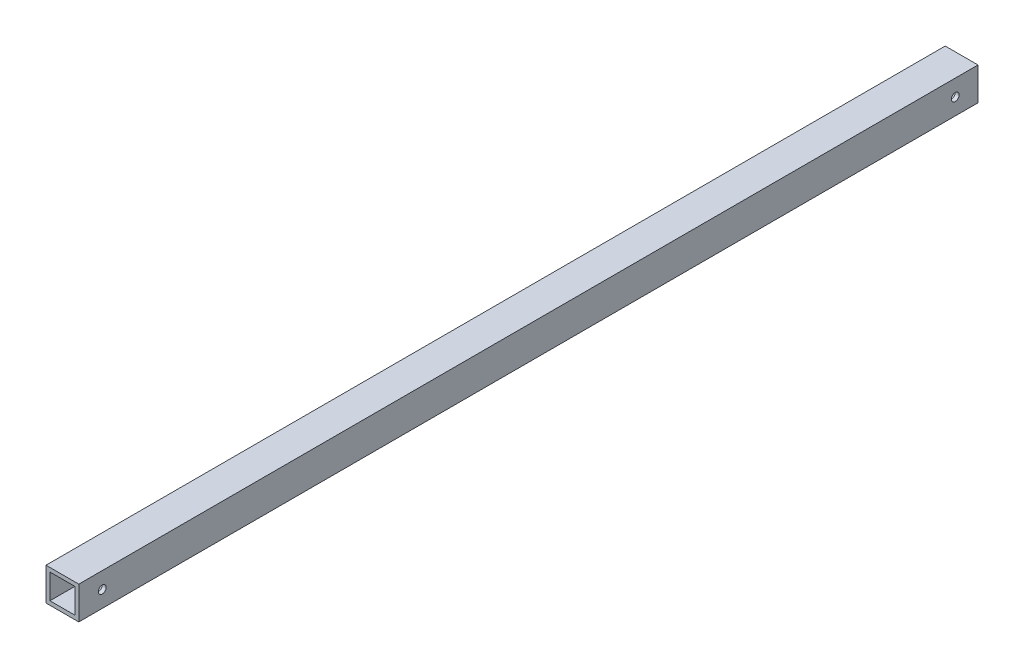
ISO-10303-21;
HEADER;
FILE_DESCRIPTION(('STEP AP214'),'2;1');
FILE_NAME('part.step','',(''),(''),'','','');
FILE_SCHEMA(('AUTOMOTIVE_DESIGN { 1 0 10303 214 1 1 1 1 }'));
ENDSEC;
DATA;
#1=APPLICATION_CONTEXT('core data for automotive mechanical design processes');
#2=APPLICATION_PROTOCOL_DEFINITION('international standard','automotive_design',2000,#1);
#3=PRODUCT_CONTEXT('',#1,'mechanical');
#4=PRODUCT('Part','Part','',(#3));
#5=PRODUCT_RELATED_PRODUCT_CATEGORY('part','',(#4));
#6=PRODUCT_DEFINITION_FORMATION('','',#4);
#7=PRODUCT_DEFINITION_CONTEXT('part definition',#1,'design');
#8=PRODUCT_DEFINITION('design','',#6,#7);
#9=PRODUCT_DEFINITION_SHAPE('','',#8);
#10=(LENGTH_UNIT() NAMED_UNIT(*) SI_UNIT(.MILLI.,.METRE.));
#11=(NAMED_UNIT(*) PLANE_ANGLE_UNIT() SI_UNIT($,.RADIAN.));
#12=(NAMED_UNIT(*) SI_UNIT($,.STERADIAN.) SOLID_ANGLE_UNIT());
#13=UNCERTAINTY_MEASURE_WITH_UNIT(LENGTH_MEASURE(1.E-05),#10,'distance_accuracy_value','');
#14=(GEOMETRIC_REPRESENTATION_CONTEXT(3) GLOBAL_UNCERTAINTY_ASSIGNED_CONTEXT((#13)) GLOBAL_UNIT_ASSIGNED_CONTEXT((#10,
#11,#12)) REPRESENTATION_CONTEXT('',''));
#15=CARTESIAN_POINT('',(0.,0.,0.));
#16=DIRECTION('',(0.,0.,1.));
#17=DIRECTION('',(1.,0.,0.));
#18=AXIS2_PLACEMENT_3D('',#15,#16,#17);
#19=CARTESIAN_POINT('',(0.,-25.,685.5));
#20=DIRECTION('',(0.,0.,1.));
#21=DIRECTION('',(1.,0.,0.));
#22=AXIS2_PLACEMENT_3D('',#19,#20,#21);
#23=PLANE('',#22);
#24=DIRECTION('',(0.,-1.,0.));
#25=VECTOR('',#24,1.);
#26=CARTESIAN_POINT('',(0.,0.,685.5));
#27=LINE('',#26,#25);
#28=CARTESIAN_POINT('',(0.,0.,685.5));
#29=VERTEX_POINT('',#28);
#30=CARTESIAN_POINT('',(0.,-25.,685.5));
#31=VERTEX_POINT('',#30);
#32=EDGE_CURVE('E135',#29,#31,#27,.T.);
#33=ORIENTED_EDGE('',*,*,#32,.T.);
#34=DIRECTION('',(1.,0.,0.));
#35=VECTOR('',#34,1.);
#36=CARTESIAN_POINT('',(0.,-25.,685.5));
#37=LINE('',#36,#35);
#38=CARTESIAN_POINT('',(25.,-25.,685.5));
#39=VERTEX_POINT('',#38);
#40=EDGE_CURVE('E138',#31,#39,#37,.T.);
#41=ORIENTED_EDGE('',*,*,#40,.T.);
#42=DIRECTION('',(0.,1.,0.));
#43=VECTOR('',#42,1.);
#44=CARTESIAN_POINT('',(25.,0.,685.5));
#45=LINE('',#44,#43);
#46=CARTESIAN_POINT('',(25.,0.,685.5));
#47=VERTEX_POINT('',#46);
#48=EDGE_CURVE('E141',#39,#47,#45,.T.);
#49=ORIENTED_EDGE('',*,*,#48,.T.);
#50=DIRECTION('',(-1.,0.,0.));
#51=VECTOR('',#50,1.);
#52=CARTESIAN_POINT('',(0.,0.,685.5));
#53=LINE('',#52,#51);
#54=EDGE_CURVE('E143',#47,#29,#53,.T.);
#55=ORIENTED_EDGE('',*,*,#54,.T.);
#56=EDGE_LOOP('',(#33,#41,#49,#55));
#57=FACE_BOUND('',#56,.T.);
#58=DIRECTION('',(1.,0.,0.));
#59=VECTOR('',#58,1.);
#60=CARTESIAN_POINT('',(3.,-22.,685.5));
#61=LINE('',#60,#59);
#62=CARTESIAN_POINT('',(3.,-22.,685.5));
#63=VERTEX_POINT('',#62);
#64=CARTESIAN_POINT('',(22.,-22.,685.5));
#65=VERTEX_POINT('',#64);
#66=EDGE_CURVE('E106',#63,#65,#61,.T.);
#67=ORIENTED_EDGE('',*,*,#66,.F.);
#68=DIRECTION('',(0.,-1.,0.));
#69=VECTOR('',#68,1.);
#70=CARTESIAN_POINT('',(3.,-3.,685.5));
#71=LINE('',#70,#69);
#72=CARTESIAN_POINT('',(3.,-3.,685.5));
#73=VERTEX_POINT('',#72);
#74=EDGE_CURVE('E98',#73,#63,#71,.T.);
#75=ORIENTED_EDGE('',*,*,#74,.F.);
#76=DIRECTION('',(-1.,0.,0.));
#77=VECTOR('',#76,1.);
#78=CARTESIAN_POINT('',(3.,-3.,685.5));
#79=LINE('',#78,#77);
#80=CARTESIAN_POINT('',(22.,-3.,685.5));
#81=VERTEX_POINT('',#80);
#82=EDGE_CURVE('E120',#81,#73,#79,.T.);
#83=ORIENTED_EDGE('',*,*,#82,.F.);
#84=DIRECTION('',(0.,1.,0.));
#85=VECTOR('',#84,1.);
#86=CARTESIAN_POINT('',(22.,-3.,685.5));
#87=LINE('',#86,#85);
#88=EDGE_CURVE('E118',#65,#81,#87,.T.);
#89=ORIENTED_EDGE('',*,*,#88,.F.);
#90=EDGE_LOOP('',(#67,#75,#83,#89));
#91=FACE_BOUND('',#90,.T.);
#92=ADVANCED_FACE('F32',(#57,#91),#23,.T.);
#93=CARTESIAN_POINT('',(0.,-25.,0.));
#94=DIRECTION('',(0.,0.,1.));
#95=DIRECTION('',(1.,0.,0.));
#96=AXIS2_PLACEMENT_3D('',#93,#94,#95);
#97=PLANE('',#96);
#98=DIRECTION('',(0.,-1.,0.));
#99=VECTOR('',#98,1.);
#100=CARTESIAN_POINT('',(0.,0.,0.));
#101=LINE('',#100,#99);
#102=CARTESIAN_POINT('',(0.,0.,0.));
#103=VERTEX_POINT('',#102);
#104=CARTESIAN_POINT('',(0.,-25.,0.));
#105=VERTEX_POINT('',#104);
#106=EDGE_CURVE('E114',#103,#105,#101,.T.);
#107=ORIENTED_EDGE('',*,*,#106,.F.);
#108=DIRECTION('',(-1.,0.,0.));
#109=VECTOR('',#108,1.);
#110=CARTESIAN_POINT('',(0.,0.,0.));
#111=LINE('',#110,#109);
#112=CARTESIAN_POINT('',(25.,0.,0.));
#113=VERTEX_POINT('',#112);
#114=EDGE_CURVE('E139',#113,#103,#111,.T.);
#115=ORIENTED_EDGE('',*,*,#114,.F.);
#116=DIRECTION('',(0.,1.,0.));
#117=VECTOR('',#116,1.);
#118=CARTESIAN_POINT('',(25.,0.,0.));
#119=LINE('',#118,#117);
#120=CARTESIAN_POINT('',(25.,-25.,0.));
#121=VERTEX_POINT('',#120);
#122=EDGE_CURVE('E150',#121,#113,#119,.T.);
#123=ORIENTED_EDGE('',*,*,#122,.F.);
#124=DIRECTION('',(1.,0.,0.));
#125=VECTOR('',#124,1.);
#126=CARTESIAN_POINT('',(0.,-25.,0.));
#127=LINE('',#126,#125);
#128=EDGE_CURVE('E148',#105,#121,#127,.T.);
#129=ORIENTED_EDGE('',*,*,#128,.F.);
#130=EDGE_LOOP('',(#107,#115,#123,#129));
#131=FACE_BOUND('',#130,.T.);
#132=DIRECTION('',(0.,-1.,0.));
#133=VECTOR('',#132,1.);
#134=CARTESIAN_POINT('',(3.,-3.,0.));
#135=LINE('',#134,#133);
#136=CARTESIAN_POINT('',(3.,-3.,0.));
#137=VERTEX_POINT('',#136);
#138=CARTESIAN_POINT('',(3.,-22.,0.));
#139=VERTEX_POINT('',#138);
#140=EDGE_CURVE('E56',#137,#139,#135,.T.);
#141=ORIENTED_EDGE('',*,*,#140,.T.);
#142=DIRECTION('',(1.,0.,0.));
#143=VECTOR('',#142,1.);
#144=CARTESIAN_POINT('',(3.,-22.,0.));
#145=LINE('',#144,#143);
#146=CARTESIAN_POINT('',(22.,-22.,0.));
#147=VERTEX_POINT('',#146);
#148=EDGE_CURVE('E113',#139,#147,#145,.T.);
#149=ORIENTED_EDGE('',*,*,#148,.T.);
#150=DIRECTION('',(0.,1.,0.));
#151=VECTOR('',#150,1.);
#152=CARTESIAN_POINT('',(22.,-3.,0.));
#153=LINE('',#152,#151);
#154=CARTESIAN_POINT('',(22.,-3.,0.));
#155=VERTEX_POINT('',#154);
#156=EDGE_CURVE('E127',#147,#155,#153,.T.);
#157=ORIENTED_EDGE('',*,*,#156,.T.);
#158=DIRECTION('',(-1.,0.,0.));
#159=VECTOR('',#158,1.);
#160=CARTESIAN_POINT('',(3.,-3.,0.));
#161=LINE('',#160,#159);
#162=EDGE_CURVE('E107',#155,#137,#161,.T.);
#163=ORIENTED_EDGE('',*,*,#162,.T.);
#164=EDGE_LOOP('',(#141,#149,#157,#163));
#165=FACE_BOUND('',#164,.T.);
#166=ADVANCED_FACE('F169',(#131,#165),#97,.F.);
#167=CARTESIAN_POINT('',(0.,0.,685.5));
#168=DIRECTION('',(1.,0.,0.));
#169=DIRECTION('',(0.,1.,0.));
#170=AXIS2_PLACEMENT_3D('',#167,#168,#169);
#171=PLANE('',#170);
#172=CARTESIAN_POINT('',(0.,-12.5,17.35));
#173=DIRECTION('',(-1.,0.,0.));
#174=DIRECTION('',(0.,-1.,0.));
#175=AXIS2_PLACEMENT_3D('',#172,#173,#174);
#176=CIRCLE('',#175,5.99999999999999);
#177=CARTESIAN_POINT('',(0.,-18.5,17.35));
#178=VERTEX_POINT('',#177);
#179=EDGE_CURVE('E259',#178,#178,#176,.T.);
#180=ORIENTED_EDGE('',*,*,#179,.F.);
#181=EDGE_LOOP('',(#180));
#182=FACE_BOUND('',#181,.T.);
#183=CARTESIAN_POINT('',(0.,-12.5,667.65));
#184=DIRECTION('',(-1.,0.,0.));
#185=DIRECTION('',(0.,-1.,0.));
#186=AXIS2_PLACEMENT_3D('',#183,#184,#185);
#187=CIRCLE('',#186,5.99999999999999);
#188=CARTESIAN_POINT('',(0.,-18.5,667.65));
#189=VERTEX_POINT('',#188);
#190=EDGE_CURVE('E214',#189,#189,#187,.T.);
#191=ORIENTED_EDGE('',*,*,#190,.F.);
#192=EDGE_LOOP('',(#191));
#193=FACE_BOUND('',#192,.T.);
#194=ORIENTED_EDGE('',*,*,#106,.T.);
#195=DIRECTION('',(0.,0.,-1.));
#196=VECTOR('',#195,1.);
#197=CARTESIAN_POINT('',(0.,-25.,685.5));
#198=LINE('',#197,#196);
#199=EDGE_CURVE('E11',#31,#105,#198,.T.);
#200=ORIENTED_EDGE('',*,*,#199,.F.);
#201=ORIENTED_EDGE('',*,*,#32,.F.);
#202=DIRECTION('',(0.,0.,-1.));
#203=VECTOR('',#202,1.);
#204=CARTESIAN_POINT('',(0.,0.,685.5));
#205=LINE('',#204,#203);
#206=EDGE_CURVE('E145',#29,#103,#205,.T.);
#207=ORIENTED_EDGE('',*,*,#206,.T.);
#208=EDGE_LOOP('',(#194,#200,#201,#207));
#209=FACE_BOUND('',#208,.T.);
#210=ADVANCED_FACE('F34',(#182,#193,#209),#171,.F.);
#211=CARTESIAN_POINT('',(0.,-25.,685.5));
#212=DIRECTION('',(0.,1.,0.));
#213=DIRECTION('',(0.,0.,1.));
#214=AXIS2_PLACEMENT_3D('',#211,#212,#213);
#215=PLANE('',#214);
#216=ORIENTED_EDGE('',*,*,#128,.T.);
#217=DIRECTION('',(0.,0.,-1.));
#218=VECTOR('',#217,1.);
#219=CARTESIAN_POINT('',(25.,-25.,685.5));
#220=LINE('',#219,#218);
#221=EDGE_CURVE('E41',#39,#121,#220,.T.);
#222=ORIENTED_EDGE('',*,*,#221,.F.);
#223=ORIENTED_EDGE('',*,*,#40,.F.);
#224=ORIENTED_EDGE('',*,*,#199,.T.);
#225=EDGE_LOOP('',(#216,#222,#223,#224));
#226=FACE_BOUND('',#225,.T.);
#227=ADVANCED_FACE('F179',(#226),#215,.F.);
#228=CARTESIAN_POINT('',(25.,0.,685.5));
#229=DIRECTION('',(-1.,0.,0.));
#230=DIRECTION('',(0.,-1.,0.));
#231=AXIS2_PLACEMENT_3D('',#228,#229,#230);
#232=PLANE('',#231);
#233=CARTESIAN_POINT('',(25.,-12.5,17.35));
#234=DIRECTION('',(1.,0.,0.));
#235=DIRECTION('',(0.,0.,-1.));
#236=AXIS2_PLACEMENT_3D('',#233,#234,#235);
#237=CIRCLE('',#236,2.99999999999999);
#238=CARTESIAN_POINT('',(25.,-12.5,14.35));
#239=VERTEX_POINT('',#238);
#240=EDGE_CURVE('E215',#239,#239,#237,.T.);
#241=ORIENTED_EDGE('',*,*,#240,.F.);
#242=EDGE_LOOP('',(#241));
#243=FACE_BOUND('',#242,.T.);
#244=CARTESIAN_POINT('',(25.,-12.5,667.65));
#245=DIRECTION('',(1.,0.,0.));
#246=DIRECTION('',(0.,0.,-1.));
#247=AXIS2_PLACEMENT_3D('',#244,#245,#246);
#248=CIRCLE('',#247,2.99999999999999);
#249=CARTESIAN_POINT('',(25.,-12.5,664.65));
#250=VERTEX_POINT('',#249);
#251=EDGE_CURVE('E218',#250,#250,#248,.T.);
#252=ORIENTED_EDGE('',*,*,#251,.F.);
#253=EDGE_LOOP('',(#252));
#254=FACE_BOUND('',#253,.T.);
#255=ORIENTED_EDGE('',*,*,#122,.T.);
#256=DIRECTION('',(0.,0.,-1.));
#257=VECTOR('',#256,1.);
#258=CARTESIAN_POINT('',(25.,0.,685.5));
#259=LINE('',#258,#257);
#260=EDGE_CURVE('E155',#47,#113,#259,.T.);
#261=ORIENTED_EDGE('',*,*,#260,.F.);
#262=ORIENTED_EDGE('',*,*,#48,.F.);
#263=ORIENTED_EDGE('',*,*,#221,.T.);
#264=EDGE_LOOP('',(#255,#261,#262,#263));
#265=FACE_BOUND('',#264,.T.);
#266=ADVANCED_FACE('F163',(#243,#254,#265),#232,.F.);
#267=CARTESIAN_POINT('',(0.,0.,685.5));
#268=DIRECTION('',(0.,-1.,0.));
#269=DIRECTION('',(0.,0.,-1.));
#270=AXIS2_PLACEMENT_3D('',#267,#268,#269);
#271=PLANE('',#270);
#272=ORIENTED_EDGE('',*,*,#114,.T.);
#273=ORIENTED_EDGE('',*,*,#206,.F.);
#274=ORIENTED_EDGE('',*,*,#54,.F.);
#275=ORIENTED_EDGE('',*,*,#260,.T.);
#276=EDGE_LOOP('',(#272,#273,#274,#275));
#277=FACE_BOUND('',#276,.T.);
#278=ADVANCED_FACE('F173',(#277),#271,.F.);
#279=CARTESIAN_POINT('',(3.,-3.,685.5));
#280=DIRECTION('',(1.,0.,0.));
#281=DIRECTION('',(0.,1.,0.));
#282=AXIS2_PLACEMENT_3D('',#279,#280,#281);
#283=PLANE('',#282);
#284=CARTESIAN_POINT('',(3.,-12.5,17.35));
#285=DIRECTION('',(1.,0.,0.));
#286=DIRECTION('',(0.,1.,0.));
#287=AXIS2_PLACEMENT_3D('',#284,#285,#286);
#288=CIRCLE('',#287,5.99999999999999);
#289=CARTESIAN_POINT('',(3.,-6.50000000000001,17.35));
#290=VERTEX_POINT('',#289);
#291=EDGE_CURVE('E209',#290,#290,#288,.F.);
#292=ORIENTED_EDGE('',*,*,#291,.T.);
#293=EDGE_LOOP('',(#292));
#294=FACE_BOUND('',#293,.T.);
#295=CARTESIAN_POINT('',(3.,-12.5,667.65));
#296=DIRECTION('',(1.,0.,0.));
#297=DIRECTION('',(0.,1.,0.));
#298=AXIS2_PLACEMENT_3D('',#295,#296,#297);
#299=CIRCLE('',#298,5.99999999999999);
#300=CARTESIAN_POINT('',(3.,-6.50000000000001,667.65));
#301=VERTEX_POINT('',#300);
#302=EDGE_CURVE('E212',#301,#301,#299,.F.);
#303=ORIENTED_EDGE('',*,*,#302,.T.);
#304=EDGE_LOOP('',(#303));
#305=FACE_BOUND('',#304,.T.);
#306=ORIENTED_EDGE('',*,*,#140,.F.);
#307=DIRECTION('',(0.,0.,-1.));
#308=VECTOR('',#307,1.);
#309=CARTESIAN_POINT('',(3.,-3.,685.5));
#310=LINE('',#309,#308);
#311=EDGE_CURVE('E102',#73,#137,#310,.T.);
#312=ORIENTED_EDGE('',*,*,#311,.F.);
#313=ORIENTED_EDGE('',*,*,#74,.T.);
#314=DIRECTION('',(0.,0.,-1.));
#315=VECTOR('',#314,1.);
#316=CARTESIAN_POINT('',(3.,-22.,685.5));
#317=LINE('',#316,#315);
#318=EDGE_CURVE('E101',#63,#139,#317,.T.);
#319=ORIENTED_EDGE('',*,*,#318,.T.);
#320=EDGE_LOOP('',(#306,#312,#313,#319));
#321=FACE_BOUND('',#320,.T.);
#322=ADVANCED_FACE('F100',(#294,#305,#321),#283,.T.);
#323=CARTESIAN_POINT('',(3.,-22.,685.5));
#324=DIRECTION('',(0.,1.,0.));
#325=DIRECTION('',(0.,0.,1.));
#326=AXIS2_PLACEMENT_3D('',#323,#324,#325);
#327=PLANE('',#326);
#328=ORIENTED_EDGE('',*,*,#148,.F.);
#329=ORIENTED_EDGE('',*,*,#318,.F.);
#330=ORIENTED_EDGE('',*,*,#66,.T.);
#331=DIRECTION('',(0.,0.,-1.));
#332=VECTOR('',#331,1.);
#333=CARTESIAN_POINT('',(22.,-22.,685.5));
#334=LINE('',#333,#332);
#335=EDGE_CURVE('E115',#65,#147,#334,.T.);
#336=ORIENTED_EDGE('',*,*,#335,.T.);
#337=EDGE_LOOP('',(#328,#329,#330,#336));
#338=FACE_BOUND('',#337,.T.);
#339=ADVANCED_FACE('F110',(#338),#327,.T.);
#340=CARTESIAN_POINT('',(22.,-3.,685.5));
#341=DIRECTION('',(-1.,0.,0.));
#342=DIRECTION('',(0.,-1.,0.));
#343=AXIS2_PLACEMENT_3D('',#340,#341,#342);
#344=PLANE('',#343);
#345=CARTESIAN_POINT('',(22.,-12.5,17.35));
#346=DIRECTION('',(-1.,0.,0.));
#347=DIRECTION('',(0.,-1.,0.));
#348=AXIS2_PLACEMENT_3D('',#345,#346,#347);
#349=CIRCLE('',#348,2.99999999999999);
#350=CARTESIAN_POINT('',(22.,-15.5,17.35));
#351=VERTEX_POINT('',#350);
#352=EDGE_CURVE('E221',#351,#351,#349,.T.);
#353=ORIENTED_EDGE('',*,*,#352,.F.);
#354=EDGE_LOOP('',(#353));
#355=FACE_BOUND('',#354,.T.);
#356=CARTESIAN_POINT('',(22.,-12.5,667.65));
#357=DIRECTION('',(-1.,0.,0.));
#358=DIRECTION('',(0.,-1.,0.));
#359=AXIS2_PLACEMENT_3D('',#356,#357,#358);
#360=CIRCLE('',#359,2.99999999999999);
#361=CARTESIAN_POINT('',(22.,-15.5,667.65));
#362=VERTEX_POINT('',#361);
#363=EDGE_CURVE('E36',#362,#362,#360,.T.);
#364=ORIENTED_EDGE('',*,*,#363,.F.);
#365=EDGE_LOOP('',(#364));
#366=FACE_BOUND('',#365,.T.);
#367=ORIENTED_EDGE('',*,*,#156,.F.);
#368=ORIENTED_EDGE('',*,*,#335,.F.);
#369=ORIENTED_EDGE('',*,*,#88,.T.);
#370=DIRECTION('',(0.,0.,-1.));
#371=VECTOR('',#370,1.);
#372=CARTESIAN_POINT('',(22.,-3.,685.5));
#373=LINE('',#372,#371);
#374=EDGE_CURVE('E48',#81,#155,#373,.T.);
#375=ORIENTED_EDGE('',*,*,#374,.T.);
#376=EDGE_LOOP('',(#367,#368,#369,#375));
#377=FACE_BOUND('',#376,.T.);
#378=ADVANCED_FACE('F205',(#355,#366,#377),#344,.T.);
#379=CARTESIAN_POINT('',(3.,-3.,685.5));
#380=DIRECTION('',(0.,-1.,0.));
#381=DIRECTION('',(0.,0.,-1.));
#382=AXIS2_PLACEMENT_3D('',#379,#380,#381);
#383=PLANE('',#382);
#384=ORIENTED_EDGE('',*,*,#162,.F.);
#385=ORIENTED_EDGE('',*,*,#374,.F.);
#386=ORIENTED_EDGE('',*,*,#82,.T.);
#387=ORIENTED_EDGE('',*,*,#311,.T.);
#388=EDGE_LOOP('',(#384,#385,#386,#387));
#389=FACE_BOUND('',#388,.T.);
#390=ADVANCED_FACE('F233',(#389),#383,.T.);
#391=CARTESIAN_POINT('',(25.,-12.5,667.65));
#392=DIRECTION('',(1.,0.,0.));
#393=DIRECTION('',(0.,0.,-1.));
#394=AXIS2_PLACEMENT_3D('',#391,#392,#393);
#395=CYLINDRICAL_SURFACE('',#394,2.99999999999999);
#396=ORIENTED_EDGE('',*,*,#363,.T.);
#397=EDGE_LOOP('',(#396));
#398=FACE_BOUND('',#397,.T.);
#399=ORIENTED_EDGE('',*,*,#251,.T.);
#400=EDGE_LOOP('',(#399));
#401=FACE_BOUND('',#400,.T.);
#402=ADVANCED_FACE('F229',(#398,#401),#395,.F.);
#403=CARTESIAN_POINT('',(25.001,-12.5,667.65));
#404=DIRECTION('',(-1.,0.,0.));
#405=DIRECTION('',(0.,-1.,0.));
#406=AXIS2_PLACEMENT_3D('',#403,#404,#405);
#407=CYLINDRICAL_SURFACE('',#406,5.99999999999999);
#408=ORIENTED_EDGE('',*,*,#302,.F.);
#409=EDGE_LOOP('',(#408));
#410=FACE_BOUND('',#409,.T.);
#411=ORIENTED_EDGE('',*,*,#190,.T.);
#412=EDGE_LOOP('',(#411));
#413=FACE_BOUND('',#412,.T.);
#414=ADVANCED_FACE('F242',(#410,#413),#407,.F.);
#415=CARTESIAN_POINT('',(25.,-12.5,17.35));
#416=DIRECTION('',(1.,0.,0.));
#417=DIRECTION('',(0.,0.,-1.));
#418=AXIS2_PLACEMENT_3D('',#415,#416,#417);
#419=CYLINDRICAL_SURFACE('',#418,2.99999999999999);
#420=ORIENTED_EDGE('',*,*,#352,.T.);
#421=EDGE_LOOP('',(#420));
#422=FACE_BOUND('',#421,.T.);
#423=ORIENTED_EDGE('',*,*,#240,.T.);
#424=EDGE_LOOP('',(#423));
#425=FACE_BOUND('',#424,.T.);
#426=ADVANCED_FACE('F247',(#422,#425),#419,.F.);
#427=CARTESIAN_POINT('',(25.001,-12.5,17.35));
#428=DIRECTION('',(-1.,0.,0.));
#429=DIRECTION('',(0.,-1.,0.));
#430=AXIS2_PLACEMENT_3D('',#427,#428,#429);
#431=CYLINDRICAL_SURFACE('',#430,5.99999999999999);
#432=ORIENTED_EDGE('',*,*,#291,.F.);
#433=EDGE_LOOP('',(#432));
#434=FACE_BOUND('',#433,.T.);
#435=ORIENTED_EDGE('',*,*,#179,.T.);
#436=EDGE_LOOP('',(#435));
#437=FACE_BOUND('',#436,.T.);
#438=ADVANCED_FACE('F250',(#434,#437),#431,.F.);
#439=CLOSED_SHELL('',(#92,#166,#210,#227,#266,#278,#322,#339,#378,#390,#402,#414,#426,#438));
#440=MANIFOLD_SOLID_BREP('B2',#439);
#441=ADVANCED_BREP_SHAPE_REPRESENTATION('',(#18,#440),#14);
#442=SHAPE_DEFINITION_REPRESENTATION(#9,#441);
ENDSEC;
END-ISO-10303-21;
